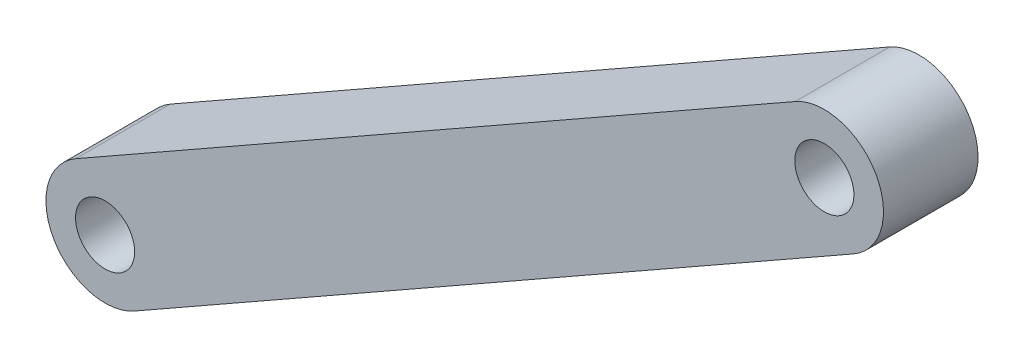
ISO-10303-21;
HEADER;
FILE_DESCRIPTION(('STEP AP214'),'2;1');
FILE_NAME('part.step','',(''),(''),'','','');
FILE_SCHEMA(('AUTOMOTIVE_DESIGN { 1 0 10303 214 1 1 1 1 }'));
ENDSEC;
DATA;
#1=APPLICATION_CONTEXT('core data for automotive mechanical design processes');
#2=APPLICATION_PROTOCOL_DEFINITION('international standard','automotive_design',2000,#1);
#3=PRODUCT_CONTEXT('',#1,'mechanical');
#4=PRODUCT('Part','Part','',(#3));
#5=PRODUCT_RELATED_PRODUCT_CATEGORY('part','',(#4));
#6=PRODUCT_DEFINITION_FORMATION('','',#4);
#7=PRODUCT_DEFINITION_CONTEXT('part definition',#1,'design');
#8=PRODUCT_DEFINITION('design','',#6,#7);
#9=PRODUCT_DEFINITION_SHAPE('','',#8);
#10=(LENGTH_UNIT() NAMED_UNIT(*) SI_UNIT(.MILLI.,.METRE.));
#11=(NAMED_UNIT(*) PLANE_ANGLE_UNIT() SI_UNIT($,.RADIAN.));
#12=(NAMED_UNIT(*) SI_UNIT($,.STERADIAN.) SOLID_ANGLE_UNIT());
#13=UNCERTAINTY_MEASURE_WITH_UNIT(LENGTH_MEASURE(1.E-05),#10,'distance_accuracy_value','');
#14=(GEOMETRIC_REPRESENTATION_CONTEXT(3) GLOBAL_UNCERTAINTY_ASSIGNED_CONTEXT((#13)) GLOBAL_UNIT_ASSIGNED_CONTEXT((#10,
#11,#12)) REPRESENTATION_CONTEXT('',''));
#15=CARTESIAN_POINT('',(0.,0.,0.));
#16=DIRECTION('',(0.,0.,1.));
#17=DIRECTION('',(1.,0.,0.));
#18=AXIS2_PLACEMENT_3D('',#15,#16,#17);
#19=CARTESIAN_POINT('',(0.,110.,8.));
#20=DIRECTION('',(0.,0.,-1.));
#21=DIRECTION('',(-1.,0.,0.));
#22=AXIS2_PLACEMENT_3D('',#19,#20,#21);
#23=CYLINDRICAL_SURFACE('',#22,5.00000000000003);
#24=CARTESIAN_POINT('',(0.,110.,0.));
#25=DIRECTION('',(0.,0.,1.));
#26=DIRECTION('',(1.,0.,0.));
#27=AXIS2_PLACEMENT_3D('',#24,#25,#26);
#28=CIRCLE('',#27,5.00000000000003);
#29=CARTESIAN_POINT('',(-2.47210125077395,114.346114978452,0.));
#30=VERTEX_POINT('',#29);
#31=CARTESIAN_POINT('',(2.47210125077397,105.653885021548,0.));
#32=VERTEX_POINT('',#31);
#33=EDGE_CURVE('E100',#30,#32,#28,.T.);
#34=ORIENTED_EDGE('',*,*,#33,.T.);
#35=DIRECTION('',(0.,0.,-1.));
#36=VECTOR('',#35,1.);
#37=CARTESIAN_POINT('',(2.47210125077397,105.653885021548,8.));
#38=LINE('',#37,#36);
#39=CARTESIAN_POINT('',(2.47210125077397,105.653885021548,8.));
#40=VERTEX_POINT('',#39);
#41=EDGE_CURVE('E11',#40,#32,#38,.T.);
#42=ORIENTED_EDGE('',*,*,#41,.F.);
#43=CARTESIAN_POINT('',(0.,110.,8.));
#44=DIRECTION('',(0.,0.,1.));
#45=DIRECTION('',(1.,0.,0.));
#46=AXIS2_PLACEMENT_3D('',#43,#44,#45);
#47=CIRCLE('',#46,5.00000000000003);
#48=CARTESIAN_POINT('',(-2.47210125077395,114.346114978452,8.));
#49=VERTEX_POINT('',#48);
#50=EDGE_CURVE('E87',#49,#40,#47,.T.);
#51=ORIENTED_EDGE('',*,*,#50,.F.);
#52=DIRECTION('',(0.,0.,-1.));
#53=VECTOR('',#52,1.);
#54=CARTESIAN_POINT('',(-2.47210125077395,114.346114978452,8.));
#55=LINE('',#54,#53);
#56=EDGE_CURVE('E96',#49,#30,#55,.T.);
#57=ORIENTED_EDGE('',*,*,#56,.T.);
#58=EDGE_LOOP('',(#34,#42,#51,#57));
#59=FACE_BOUND('',#58,.T.);
#60=ADVANCED_FACE('F34',(#59),#23,.T.);
#61=CARTESIAN_POINT('',(2.47210125077397,105.653885021548,8.));
#62=DIRECTION('',(-0.494420250154788,0.869222995690333,0.));
#63=DIRECTION('',(-0.869222995690333,-0.494420250154788,0.));
#64=AXIS2_PLACEMENT_3D('',#61,#62,#63);
#65=PLANE('',#64);
#66=DIRECTION('',(0.869222995690333,0.494420250154788,0.));
#67=VECTOR('',#66,1.);
#68=CARTESIAN_POINT('',(2.47210125077397,105.653885021548,0.));
#69=LINE('',#68,#67);
#70=CARTESIAN_POINT('',(63.3177109490973,140.263302532383,0.));
#71=VERTEX_POINT('',#70);
#72=EDGE_CURVE('E91',#32,#71,#69,.T.);
#73=ORIENTED_EDGE('',*,*,#72,.T.);
#74=DIRECTION('',(0.,0.,-1.));
#75=VECTOR('',#74,1.);
#76=CARTESIAN_POINT('',(63.3177109490973,140.263302532383,8.));
#77=LINE('',#76,#75);
#78=CARTESIAN_POINT('',(63.3177109490973,140.263302532383,8.));
#79=VERTEX_POINT('',#78);
#80=EDGE_CURVE('E43',#79,#71,#77,.T.);
#81=ORIENTED_EDGE('',*,*,#80,.F.);
#82=DIRECTION('',(0.869222995690333,0.494420250154788,0.));
#83=VECTOR('',#82,1.);
#84=CARTESIAN_POINT('',(2.47210125077397,105.653885021548,8.));
#85=LINE('',#84,#83);
#86=EDGE_CURVE('E82',#40,#79,#85,.T.);
#87=ORIENTED_EDGE('',*,*,#86,.F.);
#88=ORIENTED_EDGE('',*,*,#41,.T.);
#89=EDGE_LOOP('',(#73,#81,#87,#88));
#90=FACE_BOUND('',#89,.T.);
#91=ADVANCED_FACE('F90',(#90),#65,.F.);
#92=CARTESIAN_POINT('',(60.8456096983233,144.609417510835,8.));
#93=DIRECTION('',(0.,0.,-1.));
#94=DIRECTION('',(-1.,0.,0.));
#95=AXIS2_PLACEMENT_3D('',#92,#93,#94);
#96=CYLINDRICAL_SURFACE('',#95,5.00000000000002);
#97=CARTESIAN_POINT('',(60.8456096983233,144.609417510835,0.));
#98=DIRECTION('',(0.,0.,1.));
#99=DIRECTION('',(1.,0.,0.));
#100=AXIS2_PLACEMENT_3D('',#97,#98,#99);
#101=CIRCLE('',#100,5.00000000000002);
#102=CARTESIAN_POINT('',(58.3735084475494,148.955532489287,0.));
#103=VERTEX_POINT('',#102);
#104=EDGE_CURVE('E69',#71,#103,#101,.T.);
#105=ORIENTED_EDGE('',*,*,#104,.T.);
#106=DIRECTION('',(0.,0.,-1.));
#107=VECTOR('',#106,1.);
#108=CARTESIAN_POINT('',(58.3735084475494,148.955532489287,8.));
#109=LINE('',#108,#107);
#110=CARTESIAN_POINT('',(58.3735084475494,148.955532489287,8.));
#111=VERTEX_POINT('',#110);
#112=EDGE_CURVE('E92',#111,#103,#109,.T.);
#113=ORIENTED_EDGE('',*,*,#112,.F.);
#114=CARTESIAN_POINT('',(60.8456096983233,144.609417510835,8.));
#115=DIRECTION('',(0.,0.,1.));
#116=DIRECTION('',(1.,0.,0.));
#117=AXIS2_PLACEMENT_3D('',#114,#115,#116);
#118=CIRCLE('',#117,5.00000000000002);
#119=EDGE_CURVE('E85',#79,#111,#118,.T.);
#120=ORIENTED_EDGE('',*,*,#119,.F.);
#121=ORIENTED_EDGE('',*,*,#80,.T.);
#122=EDGE_LOOP('',(#105,#113,#120,#121));
#123=FACE_BOUND('',#122,.T.);
#124=ADVANCED_FACE('F94',(#123),#96,.T.);
#125=CARTESIAN_POINT('',(-2.47210125077395,114.346114978452,8.));
#126=DIRECTION('',(0.494420250154788,-0.869222995690333,0.));
#127=DIRECTION('',(0.869222995690333,0.494420250154788,0.));
#128=AXIS2_PLACEMENT_3D('',#125,#126,#127);
#129=PLANE('',#128);
#130=DIRECTION('',(-0.869222995690333,-0.494420250154788,0.));
#131=VECTOR('',#130,1.);
#132=CARTESIAN_POINT('',(-2.47210125077395,114.346114978452,0.));
#133=LINE('',#132,#131);
#134=EDGE_CURVE('E75',#103,#30,#133,.T.);
#135=ORIENTED_EDGE('',*,*,#134,.T.);
#136=ORIENTED_EDGE('',*,*,#56,.F.);
#137=DIRECTION('',(-0.869222995690333,-0.494420250154788,0.));
#138=VECTOR('',#137,1.);
#139=CARTESIAN_POINT('',(-2.47210125077395,114.346114978452,8.));
#140=LINE('',#139,#138);
#141=EDGE_CURVE('E52',#111,#49,#140,.T.);
#142=ORIENTED_EDGE('',*,*,#141,.F.);
#143=ORIENTED_EDGE('',*,*,#112,.T.);
#144=EDGE_LOOP('',(#135,#136,#142,#143));
#145=FACE_BOUND('',#144,.T.);
#146=ADVANCED_FACE('F128',(#145),#129,.F.);
#147=CARTESIAN_POINT('',(0.,110.,8.));
#148=DIRECTION('',(0.,0.,1.));
#149=DIRECTION('',(1.,0.,0.));
#150=AXIS2_PLACEMENT_3D('',#147,#148,#149);
#151=PLANE('',#150);
#152=CARTESIAN_POINT('',(0.,110.,8.));
#153=DIRECTION('',(0.,0.,1.));
#154=DIRECTION('',(1.,0.,0.));
#155=AXIS2_PLACEMENT_3D('',#152,#153,#154);
#156=CIRCLE('',#155,2.5);
#157=CARTESIAN_POINT('',(2.5,110.,8.));
#158=VERTEX_POINT('',#157);
#159=EDGE_CURVE('E103',#158,#158,#156,.T.);
#160=ORIENTED_EDGE('',*,*,#159,.F.);
#161=EDGE_LOOP('',(#160));
#162=FACE_BOUND('',#161,.T.);
#163=CARTESIAN_POINT('',(60.8456096983234,144.609417510835,8.));
#164=DIRECTION('',(0.,0.,1.));
#165=DIRECTION('',(1.,0.,0.));
#166=AXIS2_PLACEMENT_3D('',#163,#164,#165);
#167=CIRCLE('',#166,2.5);
#168=CARTESIAN_POINT('',(63.3456096983234,144.609417510835,8.));
#169=VERTEX_POINT('',#168);
#170=EDGE_CURVE('E110',#169,#169,#167,.T.);
#171=ORIENTED_EDGE('',*,*,#170,.F.);
#172=EDGE_LOOP('',(#171));
#173=FACE_BOUND('',#172,.T.);
#174=ORIENTED_EDGE('',*,*,#50,.T.);
#175=ORIENTED_EDGE('',*,*,#86,.T.);
#176=ORIENTED_EDGE('',*,*,#119,.T.);
#177=ORIENTED_EDGE('',*,*,#141,.T.);
#178=EDGE_LOOP('',(#174,#175,#176,#177));
#179=FACE_BOUND('',#178,.T.);
#180=ADVANCED_FACE('F83',(#162,#173,#179),#151,.T.);
#181=CARTESIAN_POINT('',(0.,110.,0.));
#182=DIRECTION('',(0.,0.,1.));
#183=DIRECTION('',(1.,0.,0.));
#184=AXIS2_PLACEMENT_3D('',#181,#182,#183);
#185=PLANE('',#184);
#186=CARTESIAN_POINT('',(0.,110.,0.));
#187=DIRECTION('',(0.,0.,1.));
#188=DIRECTION('',(1.,0.,0.));
#189=AXIS2_PLACEMENT_3D('',#186,#187,#188);
#190=CIRCLE('',#189,2.5);
#191=CARTESIAN_POINT('',(2.5,110.,0.));
#192=VERTEX_POINT('',#191);
#193=EDGE_CURVE('E37',#192,#192,#190,.T.);
#194=ORIENTED_EDGE('',*,*,#193,.T.);
#195=EDGE_LOOP('',(#194));
#196=FACE_BOUND('',#195,.T.);
#197=CARTESIAN_POINT('',(60.8456096983234,144.609417510835,0.));
#198=DIRECTION('',(0.,0.,1.));
#199=DIRECTION('',(1.,0.,0.));
#200=AXIS2_PLACEMENT_3D('',#197,#198,#199);
#201=CIRCLE('',#200,2.5);
#202=CARTESIAN_POINT('',(63.3456096983234,144.609417510835,0.));
#203=VERTEX_POINT('',#202);
#204=EDGE_CURVE('E108',#203,#203,#201,.T.);
#205=ORIENTED_EDGE('',*,*,#204,.T.);
#206=EDGE_LOOP('',(#205));
#207=FACE_BOUND('',#206,.T.);
#208=ORIENTED_EDGE('',*,*,#33,.F.);
#209=ORIENTED_EDGE('',*,*,#134,.F.);
#210=ORIENTED_EDGE('',*,*,#104,.F.);
#211=ORIENTED_EDGE('',*,*,#72,.F.);
#212=EDGE_LOOP('',(#208,#209,#210,#211));
#213=FACE_BOUND('',#212,.T.);
#214=ADVANCED_FACE('F127',(#196,#207,#213),#185,.F.);
#215=CARTESIAN_POINT('',(60.8456096983234,144.609417510835,-9.99795250723982));
#216=DIRECTION('',(0.,0.,1.));
#217=DIRECTION('',(1.,0.,0.));
#218=AXIS2_PLACEMENT_3D('',#215,#216,#217);
#219=CYLINDRICAL_SURFACE('',#218,2.5);
#220=ORIENTED_EDGE('',*,*,#170,.T.);
#221=EDGE_LOOP('',(#220));
#222=FACE_BOUND('',#221,.T.);
#223=ORIENTED_EDGE('',*,*,#204,.F.);
#224=EDGE_LOOP('',(#223));
#225=FACE_BOUND('',#224,.T.);
#226=ADVANCED_FACE('F134',(#222,#225),#219,.F.);
#227=CARTESIAN_POINT('',(0.,110.,-9.99795250723982));
#228=DIRECTION('',(0.,0.,1.));
#229=DIRECTION('',(1.,0.,0.));
#230=AXIS2_PLACEMENT_3D('',#227,#228,#229);
#231=CYLINDRICAL_SURFACE('',#230,2.5);
#232=ORIENTED_EDGE('',*,*,#159,.T.);
#233=EDGE_LOOP('',(#232));
#234=FACE_BOUND('',#233,.T.);
#235=ORIENTED_EDGE('',*,*,#193,.F.);
#236=EDGE_LOOP('',(#235));
#237=FACE_BOUND('',#236,.T.);
#238=ADVANCED_FACE('F122',(#234,#237),#231,.F.);
#239=CLOSED_SHELL('',(#60,#91,#124,#146,#180,#214,#226,#238));
#240=MANIFOLD_SOLID_BREP('B2',#239);
#241=ADVANCED_BREP_SHAPE_REPRESENTATION('',(#18,#240),#14);
#242=SHAPE_DEFINITION_REPRESENTATION(#9,#241);
ENDSEC;
END-ISO-10303-21;
